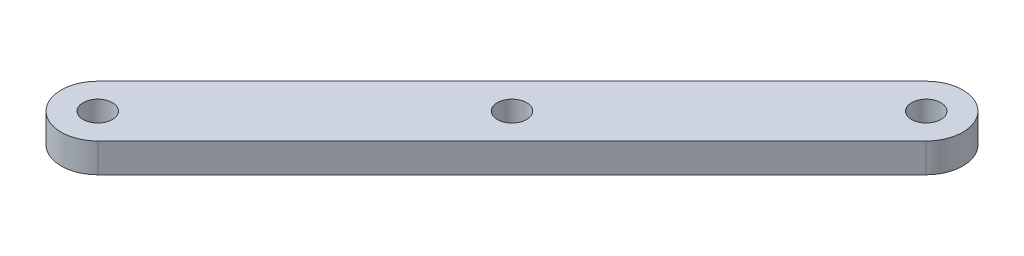
ISO-10303-21;
HEADER;
FILE_DESCRIPTION(('STEP AP214'),'2;1');
FILE_NAME('part.step','',(''),(''),'','','');
FILE_SCHEMA(('AUTOMOTIVE_DESIGN { 1 0 10303 214 1 1 1 1 }'));
ENDSEC;
DATA;
#1=APPLICATION_CONTEXT('core data for automotive mechanical design processes');
#2=APPLICATION_PROTOCOL_DEFINITION('international standard','automotive_design',2000,#1);
#3=PRODUCT_CONTEXT('',#1,'mechanical');
#4=PRODUCT('Part','Part','',(#3));
#5=PRODUCT_RELATED_PRODUCT_CATEGORY('part','',(#4));
#6=PRODUCT_DEFINITION_FORMATION('','',#4);
#7=PRODUCT_DEFINITION_CONTEXT('part definition',#1,'design');
#8=PRODUCT_DEFINITION('design','',#6,#7);
#9=PRODUCT_DEFINITION_SHAPE('','',#8);
#10=(LENGTH_UNIT() NAMED_UNIT(*) SI_UNIT(.MILLI.,.METRE.));
#11=(NAMED_UNIT(*) PLANE_ANGLE_UNIT() SI_UNIT($,.RADIAN.));
#12=(NAMED_UNIT(*) SI_UNIT($,.STERADIAN.) SOLID_ANGLE_UNIT());
#13=UNCERTAINTY_MEASURE_WITH_UNIT(LENGTH_MEASURE(1.E-05),#10,'distance_accuracy_value','');
#14=(GEOMETRIC_REPRESENTATION_CONTEXT(3) GLOBAL_UNCERTAINTY_ASSIGNED_CONTEXT((#13)) GLOBAL_UNIT_ASSIGNED_CONTEXT((#10,
#11,#12)) REPRESENTATION_CONTEXT('',''));
#15=CARTESIAN_POINT('',(0.,0.,0.));
#16=DIRECTION('',(0.,0.,1.));
#17=DIRECTION('',(1.,0.,0.));
#18=AXIS2_PLACEMENT_3D('',#15,#16,#17);
#19=CARTESIAN_POINT('',(0.,10.,0.));
#20=DIRECTION('',(0.,1.,0.));
#21=DIRECTION('',(0.,0.,1.));
#22=AXIS2_PLACEMENT_3D('',#19,#20,#21);
#23=PLANE('',#22);
#24=CARTESIAN_POINT('',(141.421356237308,10.,-141.421356237311));
#25=DIRECTION('',(0.,1.,0.));
#26=DIRECTION('',(0.,0.,1.));
#27=AXIS2_PLACEMENT_3D('',#24,#25,#26);
#28=CIRCLE('',#27,4.99999999999999);
#29=CARTESIAN_POINT('',(141.421356237308,10.,-136.421356237311));
#30=VERTEX_POINT('',#29);
#31=EDGE_CURVE('E114',#30,#30,#28,.T.);
#32=ORIENTED_EDGE('',*,*,#31,.F.);
#33=EDGE_LOOP('',(#32));
#34=FACE_BOUND('',#33,.T.);
#35=CARTESIAN_POINT('',(0.,10.,0.));
#36=DIRECTION('',(0.,1.,0.));
#37=DIRECTION('',(0.,0.,1.));
#38=AXIS2_PLACEMENT_3D('',#35,#36,#37);
#39=CIRCLE('',#38,12.5);
#40=CARTESIAN_POINT('',(-8.83883476483192,10.,-8.83883476483176));
#41=VERTEX_POINT('',#40);
#42=CARTESIAN_POINT('',(8.83883476483193,10.,8.83883476483177));
#43=VERTEX_POINT('',#42);
#44=EDGE_CURVE('E84',#41,#43,#39,.T.);
#45=ORIENTED_EDGE('',*,*,#44,.T.);
#46=DIRECTION('',(0.707106781186541,0.,-0.707106781186554));
#47=VECTOR('',#46,1.);
#48=CARTESIAN_POINT('',(150.26019100214,10.,-132.582521472479));
#49=LINE('',#48,#47);
#50=CARTESIAN_POINT('',(150.26019100214,10.,-132.582521472479));
#51=VERTEX_POINT('',#50);
#52=EDGE_CURVE('E79',#43,#51,#49,.T.);
#53=ORIENTED_EDGE('',*,*,#52,.T.);
#54=CARTESIAN_POINT('',(141.421356237308,10.,-141.421356237311));
#55=DIRECTION('',(0.,1.,0.));
#56=DIRECTION('',(0.,0.,1.));
#57=AXIS2_PLACEMENT_3D('',#54,#55,#56);
#58=CIRCLE('',#57,12.5);
#59=CARTESIAN_POINT('',(132.582521472476,10.,-150.260191002143));
#60=VERTEX_POINT('',#59);
#61=EDGE_CURVE('E82',#51,#60,#58,.T.);
#62=ORIENTED_EDGE('',*,*,#61,.T.);
#63=DIRECTION('',(-0.707106781186541,0.,0.707106781186554));
#64=VECTOR('',#63,1.);
#65=CARTESIAN_POINT('',(-8.83883476483192,10.,-8.83883476483176));
#66=LINE('',#65,#64);
#67=EDGE_CURVE('E49',#60,#41,#66,.T.);
#68=ORIENTED_EDGE('',*,*,#67,.T.);
#69=EDGE_LOOP('',(#45,#53,#62,#68));
#70=FACE_BOUND('',#69,.T.);
#71=CARTESIAN_POINT('',(0.,10.,0.));
#72=DIRECTION('',(0.,1.,0.));
#73=DIRECTION('',(0.,0.,1.));
#74=AXIS2_PLACEMENT_3D('',#71,#72,#73);
#75=CIRCLE('',#74,5.);
#76=CARTESIAN_POINT('',(0.,10.,5.));
#77=VERTEX_POINT('',#76);
#78=EDGE_CURVE('E99',#77,#77,#75,.T.);
#79=ORIENTED_EDGE('',*,*,#78,.F.);
#80=EDGE_LOOP('',(#79));
#81=FACE_BOUND('',#80,.T.);
#82=CARTESIAN_POINT('',(70.7106781186541,10.,-70.7106781186554));
#83=DIRECTION('',(0.,1.,0.));
#84=DIRECTION('',(0.,0.,1.));
#85=AXIS2_PLACEMENT_3D('',#82,#83,#84);
#86=CIRCLE('',#85,4.99999999999999);
#87=CARTESIAN_POINT('',(70.7106781186541,10.,-65.7106781186554));
#88=VERTEX_POINT('',#87);
#89=EDGE_CURVE('E120',#88,#88,#86,.T.);
#90=ORIENTED_EDGE('',*,*,#89,.F.);
#91=EDGE_LOOP('',(#90));
#92=FACE_BOUND('',#91,.T.);
#93=ADVANCED_FACE('F32',(#34,#70,#81,#92),#23,.T.);
#94=CARTESIAN_POINT('',(0.,0.,0.));
#95=DIRECTION('',(0.,1.,0.));
#96=DIRECTION('',(0.,0.,1.));
#97=AXIS2_PLACEMENT_3D('',#94,#95,#96);
#98=PLANE('',#97);
#99=CARTESIAN_POINT('',(0.,0.,0.));
#100=DIRECTION('',(0.,1.,0.));
#101=DIRECTION('',(0.,0.,1.));
#102=AXIS2_PLACEMENT_3D('',#99,#100,#101);
#103=CIRCLE('',#102,12.5);
#104=CARTESIAN_POINT('',(-8.83883476483192,0.,-8.83883476483176));
#105=VERTEX_POINT('',#104);
#106=CARTESIAN_POINT('',(8.83883476483193,0.,8.83883476483177));
#107=VERTEX_POINT('',#106);
#108=EDGE_CURVE('E96',#105,#107,#103,.T.);
#109=ORIENTED_EDGE('',*,*,#108,.F.);
#110=DIRECTION('',(-0.707106781186541,0.,0.707106781186554));
#111=VECTOR('',#110,1.);
#112=CARTESIAN_POINT('',(-8.83883476483192,0.,-8.83883476483176));
#113=LINE('',#112,#111);
#114=CARTESIAN_POINT('',(132.582521472476,0.,-150.260191002143));
#115=VERTEX_POINT('',#114);
#116=EDGE_CURVE('E72',#115,#105,#113,.T.);
#117=ORIENTED_EDGE('',*,*,#116,.F.);
#118=CARTESIAN_POINT('',(141.421356237308,0.,-141.421356237311));
#119=DIRECTION('',(0.,1.,0.));
#120=DIRECTION('',(0.,0.,1.));
#121=AXIS2_PLACEMENT_3D('',#118,#119,#120);
#122=CIRCLE('',#121,12.5);
#123=CARTESIAN_POINT('',(150.26019100214,0.,-132.582521472479));
#124=VERTEX_POINT('',#123);
#125=EDGE_CURVE('E66',#124,#115,#122,.T.);
#126=ORIENTED_EDGE('',*,*,#125,.F.);
#127=DIRECTION('',(0.707106781186541,0.,-0.707106781186554));
#128=VECTOR('',#127,1.);
#129=CARTESIAN_POINT('',(150.26019100214,0.,-132.582521472479));
#130=LINE('',#129,#128);
#131=EDGE_CURVE('E88',#107,#124,#130,.T.);
#132=ORIENTED_EDGE('',*,*,#131,.F.);
#133=EDGE_LOOP('',(#109,#117,#126,#132));
#134=FACE_BOUND('',#133,.T.);
#135=CARTESIAN_POINT('',(0.,0.,0.));
#136=DIRECTION('',(0.,1.,0.));
#137=DIRECTION('',(0.,0.,1.));
#138=AXIS2_PLACEMENT_3D('',#135,#136,#137);
#139=CIRCLE('',#138,5.);
#140=CARTESIAN_POINT('',(0.,0.,5.));
#141=VERTEX_POINT('',#140);
#142=EDGE_CURVE('E111',#141,#141,#139,.T.);
#143=ORIENTED_EDGE('',*,*,#142,.T.);
#144=EDGE_LOOP('',(#143));
#145=FACE_BOUND('',#144,.T.);
#146=CARTESIAN_POINT('',(141.421356237308,0.,-141.421356237311));
#147=DIRECTION('',(0.,1.,0.));
#148=DIRECTION('',(0.,0.,1.));
#149=AXIS2_PLACEMENT_3D('',#146,#147,#148);
#150=CIRCLE('',#149,4.99999999999999);
#151=CARTESIAN_POINT('',(141.421356237308,0.,-136.421356237311));
#152=VERTEX_POINT('',#151);
#153=EDGE_CURVE('E117',#152,#152,#150,.T.);
#154=ORIENTED_EDGE('',*,*,#153,.T.);
#155=EDGE_LOOP('',(#154));
#156=FACE_BOUND('',#155,.T.);
#157=CARTESIAN_POINT('',(70.7106781186541,0.,-70.7106781186554));
#158=DIRECTION('',(0.,1.,0.));
#159=DIRECTION('',(0.,0.,1.));
#160=AXIS2_PLACEMENT_3D('',#157,#158,#159);
#161=CIRCLE('',#160,4.99999999999999);
#162=CARTESIAN_POINT('',(70.7106781186541,0.,-65.7106781186554));
#163=VERTEX_POINT('',#162);
#164=EDGE_CURVE('E123',#163,#163,#161,.T.);
#165=ORIENTED_EDGE('',*,*,#164,.T.);
#166=EDGE_LOOP('',(#165));
#167=FACE_BOUND('',#166,.T.);
#168=ADVANCED_FACE('F107',(#134,#145,#156,#167),#98,.F.);
#169=CARTESIAN_POINT('',(0.,10.,0.));
#170=DIRECTION('',(0.,-1.,0.));
#171=DIRECTION('',(0.,0.,-1.));
#172=AXIS2_PLACEMENT_3D('',#169,#170,#171);
#173=CYLINDRICAL_SURFACE('',#172,12.5);
#174=ORIENTED_EDGE('',*,*,#108,.T.);
#175=DIRECTION('',(0.,-1.,0.));
#176=VECTOR('',#175,1.);
#177=CARTESIAN_POINT('',(8.83883476483193,10.,8.83883476483177));
#178=LINE('',#177,#176);
#179=EDGE_CURVE('E11',#43,#107,#178,.T.);
#180=ORIENTED_EDGE('',*,*,#179,.F.);
#181=ORIENTED_EDGE('',*,*,#44,.F.);
#182=DIRECTION('',(0.,-1.,0.));
#183=VECTOR('',#182,1.);
#184=CARTESIAN_POINT('',(-8.83883476483192,10.,-8.83883476483176));
#185=LINE('',#184,#183);
#186=EDGE_CURVE('E92',#41,#105,#185,.T.);
#187=ORIENTED_EDGE('',*,*,#186,.T.);
#188=EDGE_LOOP('',(#174,#180,#181,#187));
#189=FACE_BOUND('',#188,.T.);
#190=ADVANCED_FACE('F34',(#189),#173,.T.);
#191=CARTESIAN_POINT('',(150.26019100214,10.,-132.582521472479));
#192=DIRECTION('',(-0.707106781186554,0.,-0.707106781186541));
#193=DIRECTION('',(-0.707106781186541,0.,0.707106781186554));
#194=AXIS2_PLACEMENT_3D('',#191,#192,#193);
#195=PLANE('',#194);
#196=ORIENTED_EDGE('',*,*,#131,.T.);
#197=DIRECTION('',(0.,-1.,0.));
#198=VECTOR('',#197,1.);
#199=CARTESIAN_POINT('',(150.26019100214,10.,-132.582521472479));
#200=LINE('',#199,#198);
#201=EDGE_CURVE('E41',#51,#124,#200,.T.);
#202=ORIENTED_EDGE('',*,*,#201,.F.);
#203=ORIENTED_EDGE('',*,*,#52,.F.);
#204=ORIENTED_EDGE('',*,*,#179,.T.);
#205=EDGE_LOOP('',(#196,#202,#203,#204));
#206=FACE_BOUND('',#205,.T.);
#207=ADVANCED_FACE('F87',(#206),#195,.F.);
#208=CARTESIAN_POINT('',(141.421356237308,10.,-141.421356237311));
#209=DIRECTION('',(0.,-1.,0.));
#210=DIRECTION('',(0.,0.,-1.));
#211=AXIS2_PLACEMENT_3D('',#208,#209,#210);
#212=CYLINDRICAL_SURFACE('',#211,12.5);
#213=ORIENTED_EDGE('',*,*,#125,.T.);
#214=DIRECTION('',(0.,-1.,0.));
#215=VECTOR('',#214,1.);
#216=CARTESIAN_POINT('',(132.582521472476,10.,-150.260191002143));
#217=LINE('',#216,#215);
#218=EDGE_CURVE('E89',#60,#115,#217,.T.);
#219=ORIENTED_EDGE('',*,*,#218,.F.);
#220=ORIENTED_EDGE('',*,*,#61,.F.);
#221=ORIENTED_EDGE('',*,*,#201,.T.);
#222=EDGE_LOOP('',(#213,#219,#220,#221));
#223=FACE_BOUND('',#222,.T.);
#224=ADVANCED_FACE('F90',(#223),#212,.T.);
#225=CARTESIAN_POINT('',(-8.83883476483192,10.,-8.83883476483176));
#226=DIRECTION('',(0.707106781186554,0.,0.707106781186541));
#227=DIRECTION('',(0.707106781186541,0.,-0.707106781186554));
#228=AXIS2_PLACEMENT_3D('',#225,#226,#227);
#229=PLANE('',#228);
#230=ORIENTED_EDGE('',*,*,#116,.T.);
#231=ORIENTED_EDGE('',*,*,#186,.F.);
#232=ORIENTED_EDGE('',*,*,#67,.F.);
#233=ORIENTED_EDGE('',*,*,#218,.T.);
#234=EDGE_LOOP('',(#230,#231,#232,#233));
#235=FACE_BOUND('',#234,.T.);
#236=ADVANCED_FACE('F104',(#235),#229,.F.);
#237=CARTESIAN_POINT('',(0.,10.,0.));
#238=DIRECTION('',(0.,-1.,0.));
#239=DIRECTION('',(0.,0.,-1.));
#240=AXIS2_PLACEMENT_3D('',#237,#238,#239);
#241=CYLINDRICAL_SURFACE('',#240,5.);
#242=ORIENTED_EDGE('',*,*,#78,.T.);
#243=EDGE_LOOP('',(#242));
#244=FACE_BOUND('',#243,.T.);
#245=ORIENTED_EDGE('',*,*,#142,.F.);
#246=EDGE_LOOP('',(#245));
#247=FACE_BOUND('',#246,.T.);
#248=ADVANCED_FACE('F141',(#244,#247),#241,.F.);
#249=CARTESIAN_POINT('',(141.421356237308,10.,-141.421356237311));
#250=DIRECTION('',(0.,-1.,0.));
#251=DIRECTION('',(0.,0.,-1.));
#252=AXIS2_PLACEMENT_3D('',#249,#250,#251);
#253=CYLINDRICAL_SURFACE('',#252,4.99999999999999);
#254=ORIENTED_EDGE('',*,*,#31,.T.);
#255=EDGE_LOOP('',(#254));
#256=FACE_BOUND('',#255,.T.);
#257=ORIENTED_EDGE('',*,*,#153,.F.);
#258=EDGE_LOOP('',(#257));
#259=FACE_BOUND('',#258,.T.);
#260=ADVANCED_FACE('F187',(#256,#259),#253,.F.);
#261=CARTESIAN_POINT('',(70.7106781186541,10.,-70.7106781186554));
#262=DIRECTION('',(0.,-1.,0.));
#263=DIRECTION('',(0.,0.,-1.));
#264=AXIS2_PLACEMENT_3D('',#261,#262,#263);
#265=CYLINDRICAL_SURFACE('',#264,4.99999999999999);
#266=ORIENTED_EDGE('',*,*,#89,.T.);
#267=EDGE_LOOP('',(#266));
#268=FACE_BOUND('',#267,.T.);
#269=ORIENTED_EDGE('',*,*,#164,.F.);
#270=EDGE_LOOP('',(#269));
#271=FACE_BOUND('',#270,.T.);
#272=ADVANCED_FACE('F129',(#268,#271),#265,.F.);
#273=CLOSED_SHELL('',(#93,#168,#190,#207,#224,#236,#248,#260,#272));
#274=MANIFOLD_SOLID_BREP('B2',#273);
#275=ADVANCED_BREP_SHAPE_REPRESENTATION('',(#18,#274),#14);
#276=SHAPE_DEFINITION_REPRESENTATION(#9,#275);
ENDSEC;
END-ISO-10303-21;
